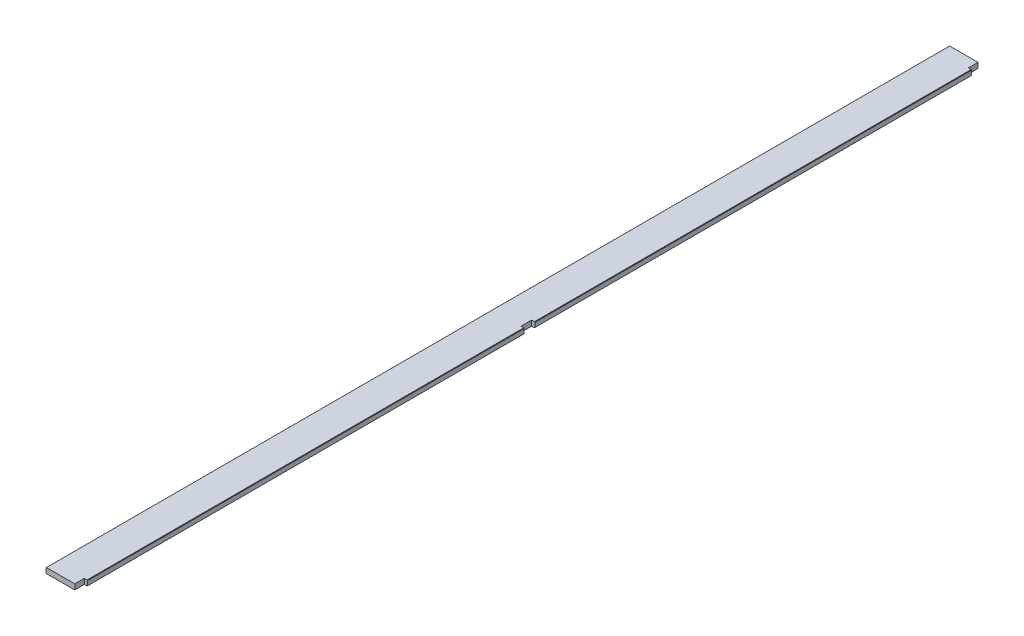
ISO-10303-21;
HEADER;
FILE_DESCRIPTION(('STEP AP214'),'2;1');
FILE_NAME('part.step','',(''),(''),'','','');
FILE_SCHEMA(('AUTOMOTIVE_DESIGN { 1 0 10303 214 1 1 1 1 }'));
ENDSEC;
DATA;
#1=APPLICATION_CONTEXT('core data for automotive mechanical design processes');
#2=APPLICATION_PROTOCOL_DEFINITION('international standard','automotive_design',2000,#1);
#3=PRODUCT_CONTEXT('',#1,'mechanical');
#4=PRODUCT('Part','Part','',(#3));
#5=PRODUCT_RELATED_PRODUCT_CATEGORY('part','',(#4));
#6=PRODUCT_DEFINITION_FORMATION('','',#4);
#7=PRODUCT_DEFINITION_CONTEXT('part definition',#1,'design');
#8=PRODUCT_DEFINITION('design','',#6,#7);
#9=PRODUCT_DEFINITION_SHAPE('','',#8);
#10=(LENGTH_UNIT() NAMED_UNIT(*) SI_UNIT(.MILLI.,.METRE.));
#11=(NAMED_UNIT(*) PLANE_ANGLE_UNIT() SI_UNIT($,.RADIAN.));
#12=(NAMED_UNIT(*) SI_UNIT($,.STERADIAN.) SOLID_ANGLE_UNIT());
#13=UNCERTAINTY_MEASURE_WITH_UNIT(LENGTH_MEASURE(1.E-05),#10,'distance_accuracy_value','');
#14=(GEOMETRIC_REPRESENTATION_CONTEXT(3) GLOBAL_UNCERTAINTY_ASSIGNED_CONTEXT((#13)) GLOBAL_UNIT_ASSIGNED_CONTEXT((#10,
#11,#12)) REPRESENTATION_CONTEXT('',''));
#15=CARTESIAN_POINT('',(0.,0.,0.));
#16=DIRECTION('',(0.,0.,1.));
#17=DIRECTION('',(1.,0.,0.));
#18=AXIS2_PLACEMENT_3D('',#15,#16,#17);
#19=CARTESIAN_POINT('',(73.,-12.5,4240.));
#20=DIRECTION('',(-0.707106781186547,0.707106781186548,0.));
#21=DIRECTION('',(-0.707106781186548,-0.707106781186547,0.));
#22=AXIS2_PLACEMENT_3D('',#19,#20,#21);
#23=PLANE('',#22);
#24=DIRECTION('',(0.,0.,-1.));
#25=VECTOR('',#24,1.);
#26=CARTESIAN_POINT('',(75.,-10.5,4240.));
#27=LINE('',#26,#25);
#28=CARTESIAN_POINT('',(75.,-10.5,4195.));
#29=VERTEX_POINT('',#28);
#30=CARTESIAN_POINT('',(75.,-10.5,2145.));
#31=VERTEX_POINT('',#30);
#32=EDGE_CURVE('E278',#29,#31,#27,.T.);
#33=ORIENTED_EDGE('',*,*,#32,.F.);
#34=DIRECTION('',(-0.707106781186548,-0.707106781186547,0.));
#35=VECTOR('',#34,1.);
#36=CARTESIAN_POINT('',(73.,-12.5,4195.));
#37=LINE('',#36,#35);
#38=CARTESIAN_POINT('',(73.,-12.5,4195.));
#39=VERTEX_POINT('',#38);
#40=EDGE_CURVE('E243',#29,#39,#37,.T.);
#41=ORIENTED_EDGE('',*,*,#40,.T.);
#42=DIRECTION('',(0.,0.,-1.));
#43=VECTOR('',#42,1.);
#44=CARTESIAN_POINT('',(73.,-12.5,4240.));
#45=LINE('',#44,#43);
#46=CARTESIAN_POINT('',(73.,-12.5,2145.));
#47=VERTEX_POINT('',#46);
#48=EDGE_CURVE('E281',#39,#47,#45,.T.);
#49=ORIENTED_EDGE('',*,*,#48,.T.);
#50=DIRECTION('',(0.707106781186548,0.707106781186547,0.));
#51=VECTOR('',#50,1.);
#52=CARTESIAN_POINT('',(73.,-12.5,2145.));
#53=LINE('',#52,#51);
#54=EDGE_CURVE('E240',#47,#31,#53,.T.);
#55=ORIENTED_EDGE('',*,*,#54,.T.);
#56=EDGE_LOOP('',(#33,#41,#49,#55));
#57=FACE_BOUND('',#56,.T.);
#58=ADVANCED_FACE('F37',(#57),#23,.F.);
#59=CARTESIAN_POINT('',(75.,10.5,4240.));
#60=DIRECTION('',(-1.,0.,0.));
#61=DIRECTION('',(0.,0.,1.));
#62=AXIS2_PLACEMENT_3D('',#59,#60,#61);
#63=PLANE('',#62);
#64=DIRECTION('',(0.,0.,-1.));
#65=VECTOR('',#64,1.);
#66=CARTESIAN_POINT('',(75.,10.5,4240.));
#67=LINE('',#66,#65);
#68=CARTESIAN_POINT('',(75.,10.5,4195.));
#69=VERTEX_POINT('',#68);
#70=CARTESIAN_POINT('',(75.,10.5,2145.));
#71=VERTEX_POINT('',#70);
#72=EDGE_CURVE('E274',#69,#71,#67,.T.);
#73=ORIENTED_EDGE('',*,*,#72,.F.);
#74=DIRECTION('',(0.,1.,0.));
#75=VECTOR('',#74,1.);
#76=CARTESIAN_POINT('',(75.,-12.5,4195.));
#77=LINE('',#76,#75);
#78=EDGE_CURVE('E205',#29,#69,#77,.T.);
#79=ORIENTED_EDGE('',*,*,#78,.F.);
#80=ORIENTED_EDGE('',*,*,#32,.T.);
#81=DIRECTION('',(0.,1.,0.));
#82=VECTOR('',#81,1.);
#83=CARTESIAN_POINT('',(75.,-12.5,2145.));
#84=LINE('',#83,#82);
#85=EDGE_CURVE('E208',#31,#71,#84,.T.);
#86=ORIENTED_EDGE('',*,*,#85,.T.);
#87=EDGE_LOOP('',(#73,#79,#80,#86));
#88=FACE_BOUND('',#87,.T.);
#89=ADVANCED_FACE('F308',(#88),#63,.F.);
#90=CARTESIAN_POINT('',(73.,12.5,4240.));
#91=DIRECTION('',(-0.707106781186547,-0.707106781186548,0.));
#92=DIRECTION('',(0.707106781186548,-0.707106781186547,0.));
#93=AXIS2_PLACEMENT_3D('',#90,#91,#92);
#94=PLANE('',#93);
#95=DIRECTION('',(0.,0.,-1.));
#96=VECTOR('',#95,1.);
#97=CARTESIAN_POINT('',(73.,12.5,4240.));
#98=LINE('',#97,#96);
#99=CARTESIAN_POINT('',(73.,12.5,4195.));
#100=VERTEX_POINT('',#99);
#101=CARTESIAN_POINT('',(73.,12.5,2145.));
#102=VERTEX_POINT('',#101);
#103=EDGE_CURVE('E270',#100,#102,#98,.T.);
#104=ORIENTED_EDGE('',*,*,#103,.F.);
#105=DIRECTION('',(0.707106781186548,-0.707106781186547,0.));
#106=VECTOR('',#105,1.);
#107=CARTESIAN_POINT('',(73.,12.5,4195.));
#108=LINE('',#107,#106);
#109=EDGE_CURVE('E45',#100,#69,#108,.T.);
#110=ORIENTED_EDGE('',*,*,#109,.T.);
#111=ORIENTED_EDGE('',*,*,#72,.T.);
#112=DIRECTION('',(-0.707106781186548,0.707106781186547,0.));
#113=VECTOR('',#112,1.);
#114=CARTESIAN_POINT('',(73.,12.5,2145.));
#115=LINE('',#114,#113);
#116=EDGE_CURVE('E295',#71,#102,#115,.T.);
#117=ORIENTED_EDGE('',*,*,#116,.T.);
#118=EDGE_LOOP('',(#104,#110,#111,#117));
#119=FACE_BOUND('',#118,.T.);
#120=ADVANCED_FACE('F302',(#119),#94,.F.);
#121=CARTESIAN_POINT('',(-73.,12.5,4240.));
#122=DIRECTION('',(0.,-1.,0.));
#123=DIRECTION('',(0.,0.,-1.));
#124=AXIS2_PLACEMENT_3D('',#121,#122,#123);
#125=PLANE('',#124);
#126=CARTESIAN_POINT('',(73.,12.5,2095.));
#127=VERTEX_POINT('',#126);
#128=CARTESIAN_POINT('',(73.,12.5,45.));
#129=VERTEX_POINT('',#128);
#130=EDGE_CURVE('E259',#127,#129,#98,.T.);
#131=ORIENTED_EDGE('',*,*,#130,.T.);
#132=DIRECTION('',(1.,0.,0.));
#133=VECTOR('',#132,1.);
#134=CARTESIAN_POINT('',(75.,12.5,45.));
#135=LINE('',#134,#133);
#136=CARTESIAN_POINT('',(60.,12.5,45.));
#137=VERTEX_POINT('',#136);
#138=EDGE_CURVE('E189',#137,#129,#135,.T.);
#139=ORIENTED_EDGE('',*,*,#138,.F.);
#140=DIRECTION('',(0.,0.,1.));
#141=VECTOR('',#140,1.);
#142=CARTESIAN_POINT('',(60.,12.5,0.));
#143=LINE('',#142,#141);
#144=CARTESIAN_POINT('',(60.,12.5,0.));
#145=VERTEX_POINT('',#144);
#146=EDGE_CURVE('E169',#145,#137,#143,.T.);
#147=ORIENTED_EDGE('',*,*,#146,.F.);
#148=DIRECTION('',(-1.,0.,0.));
#149=VECTOR('',#148,1.);
#150=CARTESIAN_POINT('',(-73.,12.5,0.));
#151=LINE('',#150,#149);
#152=CARTESIAN_POINT('',(-73.,12.5,0.));
#153=VERTEX_POINT('',#152);
#154=EDGE_CURVE('E247',#145,#153,#151,.T.);
#155=ORIENTED_EDGE('',*,*,#154,.T.);
#156=DIRECTION('',(0.,0.,-1.));
#157=VECTOR('',#156,1.);
#158=CARTESIAN_POINT('',(-73.,12.5,4240.));
#159=LINE('',#158,#157);
#160=CARTESIAN_POINT('',(-73.,12.5,4240.));
#161=VERTEX_POINT('',#160);
#162=EDGE_CURVE('E290',#161,#153,#159,.T.);
#163=ORIENTED_EDGE('',*,*,#162,.F.);
#164=DIRECTION('',(-1.,0.,0.));
#165=VECTOR('',#164,1.);
#166=CARTESIAN_POINT('',(-73.,12.5,4240.));
#167=LINE('',#166,#165);
#168=CARTESIAN_POINT('',(60.,12.5,4240.));
#169=VERTEX_POINT('',#168);
#170=EDGE_CURVE('E248',#169,#161,#167,.T.);
#171=ORIENTED_EDGE('',*,*,#170,.F.);
#172=DIRECTION('',(0.,0.,1.));
#173=VECTOR('',#172,1.);
#174=CARTESIAN_POINT('',(60.,12.5,4240.));
#175=LINE('',#174,#173);
#176=CARTESIAN_POINT('',(60.,12.5,4195.));
#177=VERTEX_POINT('',#176);
#178=EDGE_CURVE('E60',#177,#169,#175,.T.);
#179=ORIENTED_EDGE('',*,*,#178,.F.);
#180=DIRECTION('',(-1.,0.,0.));
#181=VECTOR('',#180,1.);
#182=CARTESIAN_POINT('',(75.,12.5,4195.));
#183=LINE('',#182,#181);
#184=EDGE_CURVE('E206',#100,#177,#183,.T.);
#185=ORIENTED_EDGE('',*,*,#184,.F.);
#186=ORIENTED_EDGE('',*,*,#103,.T.);
#187=DIRECTION('',(1.,0.,0.));
#188=VECTOR('',#187,1.);
#189=CARTESIAN_POINT('',(75.,12.5,2145.));
#190=LINE('',#189,#188);
#191=CARTESIAN_POINT('',(60.,12.5,2145.));
#192=VERTEX_POINT('',#191);
#193=EDGE_CURVE('E218',#192,#102,#190,.T.);
#194=ORIENTED_EDGE('',*,*,#193,.F.);
#195=DIRECTION('',(0.,0.,1.));
#196=VECTOR('',#195,1.);
#197=CARTESIAN_POINT('',(60.,12.5,2145.));
#198=LINE('',#197,#196);
#199=CARTESIAN_POINT('',(60.,12.5,2095.));
#200=VERTEX_POINT('',#199);
#201=EDGE_CURVE('E226',#200,#192,#198,.T.);
#202=ORIENTED_EDGE('',*,*,#201,.F.);
#203=DIRECTION('',(-1.,0.,0.));
#204=VECTOR('',#203,1.);
#205=CARTESIAN_POINT('',(75.,12.5,2095.));
#206=LINE('',#205,#204);
#207=EDGE_CURVE('E224',#127,#200,#206,.T.);
#208=ORIENTED_EDGE('',*,*,#207,.F.);
#209=EDGE_LOOP('',(#131,#139,#147,#155,#163,#171,#179,#185,#186,#194,#202,#208));
#210=FACE_BOUND('',#209,.T.);
#211=ADVANCED_FACE('F39',(#210),#125,.F.);
#212=CARTESIAN_POINT('',(-75.,10.5,4240.));
#213=DIRECTION('',(0.707106781186547,-0.707106781186548,0.));
#214=DIRECTION('',(0.707106781186548,0.707106781186547,0.));
#215=AXIS2_PLACEMENT_3D('',#212,#213,#214);
#216=PLANE('',#215);
#217=DIRECTION('',(-0.707106781186548,-0.707106781186547,0.));
#218=VECTOR('',#217,1.);
#219=CARTESIAN_POINT('',(-75.,10.5,0.));
#220=LINE('',#219,#218);
#221=CARTESIAN_POINT('',(-75.,10.5,0.));
#222=VERTEX_POINT('',#221);
#223=EDGE_CURVE('E261',#153,#222,#220,.T.);
#224=ORIENTED_EDGE('',*,*,#223,.T.);
#225=DIRECTION('',(0.,0.,-1.));
#226=VECTOR('',#225,1.);
#227=CARTESIAN_POINT('',(-75.,10.5,4240.));
#228=LINE('',#227,#226);
#229=CARTESIAN_POINT('',(-75.,10.5,4240.));
#230=VERTEX_POINT('',#229);
#231=EDGE_CURVE('E287',#230,#222,#228,.T.);
#232=ORIENTED_EDGE('',*,*,#231,.F.);
#233=DIRECTION('',(-0.707106781186548,-0.707106781186547,0.));
#234=VECTOR('',#233,1.);
#235=CARTESIAN_POINT('',(-75.,10.5,4240.));
#236=LINE('',#235,#234);
#237=EDGE_CURVE('E250',#161,#230,#236,.T.);
#238=ORIENTED_EDGE('',*,*,#237,.F.);
#239=ORIENTED_EDGE('',*,*,#162,.T.);
#240=EDGE_LOOP('',(#224,#232,#238,#239));
#241=FACE_BOUND('',#240,.T.);
#242=ADVANCED_FACE('F382',(#241),#216,.F.);
#243=CARTESIAN_POINT('',(-75.,10.5,4240.));
#244=DIRECTION('',(1.,0.,0.));
#245=DIRECTION('',(0.,0.,-1.));
#246=AXIS2_PLACEMENT_3D('',#243,#244,#245);
#247=PLANE('',#246);
#248=DIRECTION('',(0.,-1.,0.));
#249=VECTOR('',#248,1.);
#250=CARTESIAN_POINT('',(-75.,10.5,0.));
#251=LINE('',#250,#249);
#252=CARTESIAN_POINT('',(-75.,-10.5,0.));
#253=VERTEX_POINT('',#252);
#254=EDGE_CURVE('E263',#222,#253,#251,.T.);
#255=ORIENTED_EDGE('',*,*,#254,.T.);
#256=DIRECTION('',(0.,0.,-1.));
#257=VECTOR('',#256,1.);
#258=CARTESIAN_POINT('',(-75.,-10.5,4240.));
#259=LINE('',#258,#257);
#260=CARTESIAN_POINT('',(-75.,-10.5,4240.));
#261=VERTEX_POINT('',#260);
#262=EDGE_CURVE('E284',#261,#253,#259,.T.);
#263=ORIENTED_EDGE('',*,*,#262,.F.);
#264=DIRECTION('',(0.,-1.,0.));
#265=VECTOR('',#264,1.);
#266=CARTESIAN_POINT('',(-75.,10.5,4240.));
#267=LINE('',#266,#265);
#268=EDGE_CURVE('E252',#230,#261,#267,.T.);
#269=ORIENTED_EDGE('',*,*,#268,.F.);
#270=ORIENTED_EDGE('',*,*,#231,.T.);
#271=EDGE_LOOP('',(#255,#263,#269,#270));
#272=FACE_BOUND('',#271,.T.);
#273=ADVANCED_FACE('F378',(#272),#247,.F.);
#274=CARTESIAN_POINT('',(-75.,-10.5,4240.));
#275=DIRECTION('',(0.707106781186547,0.707106781186548,0.));
#276=DIRECTION('',(-0.707106781186548,0.707106781186547,0.));
#277=AXIS2_PLACEMENT_3D('',#274,#275,#276);
#278=PLANE('',#277);
#279=DIRECTION('',(0.707106781186548,-0.707106781186547,0.));
#280=VECTOR('',#279,1.);
#281=CARTESIAN_POINT('',(-75.,-10.5,0.));
#282=LINE('',#281,#280);
#283=CARTESIAN_POINT('',(-73.,-12.5,0.));
#284=VERTEX_POINT('',#283);
#285=EDGE_CURVE('E265',#253,#284,#282,.T.);
#286=ORIENTED_EDGE('',*,*,#285,.T.);
#287=DIRECTION('',(0.,0.,-1.));
#288=VECTOR('',#287,1.);
#289=CARTESIAN_POINT('',(-73.,-12.5,4240.));
#290=LINE('',#289,#288);
#291=CARTESIAN_POINT('',(-73.,-12.5,4240.));
#292=VERTEX_POINT('',#291);
#293=EDGE_CURVE('E282',#292,#284,#290,.T.);
#294=ORIENTED_EDGE('',*,*,#293,.F.);
#295=DIRECTION('',(0.707106781186548,-0.707106781186547,0.));
#296=VECTOR('',#295,1.);
#297=CARTESIAN_POINT('',(-75.,-10.5,4240.));
#298=LINE('',#297,#296);
#299=EDGE_CURVE('E254',#261,#292,#298,.T.);
#300=ORIENTED_EDGE('',*,*,#299,.F.);
#301=ORIENTED_EDGE('',*,*,#262,.T.);
#302=EDGE_LOOP('',(#286,#294,#300,#301));
#303=FACE_BOUND('',#302,.T.);
#304=ADVANCED_FACE('F336',(#303),#278,.F.);
#305=CARTESIAN_POINT('',(-73.,-12.5,4240.));
#306=DIRECTION('',(0.,1.,0.));
#307=DIRECTION('',(0.,0.,1.));
#308=AXIS2_PLACEMENT_3D('',#305,#306,#307);
#309=PLANE('',#308);
#310=DIRECTION('',(0.,0.,1.));
#311=VECTOR('',#310,1.);
#312=CARTESIAN_POINT('',(60.,-12.5,0.));
#313=LINE('',#312,#311);
#314=CARTESIAN_POINT('',(60.,-12.5,0.));
#315=VERTEX_POINT('',#314);
#316=CARTESIAN_POINT('',(60.,-12.5,45.));
#317=VERTEX_POINT('',#316);
#318=EDGE_CURVE('E166',#315,#317,#313,.T.);
#319=ORIENTED_EDGE('',*,*,#318,.T.);
#320=DIRECTION('',(1.,0.,0.));
#321=VECTOR('',#320,1.);
#322=CARTESIAN_POINT('',(75.,-12.5,45.));
#323=LINE('',#322,#321);
#324=CARTESIAN_POINT('',(73.,-12.5,45.));
#325=VERTEX_POINT('',#324);
#326=EDGE_CURVE('E176',#317,#325,#323,.T.);
#327=ORIENTED_EDGE('',*,*,#326,.T.);
#328=CARTESIAN_POINT('',(73.,-12.5,2095.));
#329=VERTEX_POINT('',#328);
#330=EDGE_CURVE('E279',#329,#325,#45,.T.);
#331=ORIENTED_EDGE('',*,*,#330,.F.);
#332=DIRECTION('',(-1.,0.,0.));
#333=VECTOR('',#332,1.);
#334=CARTESIAN_POINT('',(75.,-12.5,2095.));
#335=LINE('',#334,#333);
#336=CARTESIAN_POINT('',(60.,-12.5,2095.));
#337=VERTEX_POINT('',#336);
#338=EDGE_CURVE('E214',#329,#337,#335,.T.);
#339=ORIENTED_EDGE('',*,*,#338,.T.);
#340=DIRECTION('',(0.,0.,1.));
#341=VECTOR('',#340,1.);
#342=CARTESIAN_POINT('',(60.,-12.5,2145.));
#343=LINE('',#342,#341);
#344=CARTESIAN_POINT('',(60.,-12.5,2145.));
#345=VERTEX_POINT('',#344);
#346=EDGE_CURVE('E217',#337,#345,#343,.T.);
#347=ORIENTED_EDGE('',*,*,#346,.T.);
#348=DIRECTION('',(1.,0.,0.));
#349=VECTOR('',#348,1.);
#350=CARTESIAN_POINT('',(75.,-12.5,2145.));
#351=LINE('',#350,#349);
#352=EDGE_CURVE('E221',#345,#47,#351,.T.);
#353=ORIENTED_EDGE('',*,*,#352,.T.);
#354=ORIENTED_EDGE('',*,*,#48,.F.);
#355=DIRECTION('',(-1.,0.,0.));
#356=VECTOR('',#355,1.);
#357=CARTESIAN_POINT('',(75.,-12.5,4195.));
#358=LINE('',#357,#356);
#359=CARTESIAN_POINT('',(60.,-12.5,4195.));
#360=VERTEX_POINT('',#359);
#361=EDGE_CURVE('E199',#39,#360,#358,.T.);
#362=ORIENTED_EDGE('',*,*,#361,.T.);
#363=DIRECTION('',(0.,0.,1.));
#364=VECTOR('',#363,1.);
#365=CARTESIAN_POINT('',(60.,-12.5,4240.));
#366=LINE('',#365,#364);
#367=CARTESIAN_POINT('',(60.,-12.5,4240.));
#368=VERTEX_POINT('',#367);
#369=EDGE_CURVE('E202',#360,#368,#366,.T.);
#370=ORIENTED_EDGE('',*,*,#369,.T.);
#371=DIRECTION('',(1.,0.,0.));
#372=VECTOR('',#371,1.);
#373=CARTESIAN_POINT('',(-73.,-12.5,4240.));
#374=LINE('',#373,#372);
#375=EDGE_CURVE('E256',#292,#368,#374,.T.);
#376=ORIENTED_EDGE('',*,*,#375,.F.);
#377=ORIENTED_EDGE('',*,*,#293,.T.);
#378=DIRECTION('',(1.,0.,0.));
#379=VECTOR('',#378,1.);
#380=CARTESIAN_POINT('',(-73.,-12.5,0.));
#381=LINE('',#380,#379);
#382=EDGE_CURVE('E188',#284,#315,#381,.T.);
#383=ORIENTED_EDGE('',*,*,#382,.T.);
#384=EDGE_LOOP('',(#319,#327,#331,#339,#347,#353,#354,#362,#370,#376,#377,#383));
#385=FACE_BOUND('',#384,.T.);
#386=ADVANCED_FACE('F185',(#385),#309,.F.);
#387=ORIENTED_EDGE('',*,*,#330,.T.);
#388=DIRECTION('',(0.707106781186548,0.707106781186547,0.));
#389=VECTOR('',#388,1.);
#390=CARTESIAN_POINT('',(73.,-12.5,44.9999999999999));
#391=LINE('',#390,#389);
#392=CARTESIAN_POINT('',(75.,-10.5,45.));
#393=VERTEX_POINT('',#392);
#394=EDGE_CURVE('E179',#325,#393,#391,.T.);
#395=ORIENTED_EDGE('',*,*,#394,.T.);
#396=CARTESIAN_POINT('',(75.,-10.5,2095.));
#397=VERTEX_POINT('',#396);
#398=EDGE_CURVE('E275',#397,#393,#27,.T.);
#399=ORIENTED_EDGE('',*,*,#398,.F.);
#400=DIRECTION('',(-0.707106781186548,-0.707106781186547,0.));
#401=VECTOR('',#400,1.);
#402=CARTESIAN_POINT('',(73.,-12.5,2095.));
#403=LINE('',#402,#401);
#404=EDGE_CURVE('E196',#397,#329,#403,.T.);
#405=ORIENTED_EDGE('',*,*,#404,.T.);
#406=EDGE_LOOP('',(#387,#395,#399,#405));
#407=FACE_BOUND('',#406,.T.);
#408=ADVANCED_FACE('F352',(#407),#23,.F.);
#409=ORIENTED_EDGE('',*,*,#398,.T.);
#410=DIRECTION('',(0.,1.,0.));
#411=VECTOR('',#410,1.);
#412=CARTESIAN_POINT('',(75.,-12.5,45.));
#413=LINE('',#412,#411);
#414=CARTESIAN_POINT('',(75.,10.5,45.));
#415=VERTEX_POINT('',#414);
#416=EDGE_CURVE('E172',#393,#415,#413,.T.);
#417=ORIENTED_EDGE('',*,*,#416,.T.);
#418=CARTESIAN_POINT('',(75.,10.5,2095.));
#419=VERTEX_POINT('',#418);
#420=EDGE_CURVE('E271',#419,#415,#67,.T.);
#421=ORIENTED_EDGE('',*,*,#420,.F.);
#422=DIRECTION('',(0.,1.,0.));
#423=VECTOR('',#422,1.);
#424=CARTESIAN_POINT('',(75.,-12.5,2095.));
#425=LINE('',#424,#423);
#426=EDGE_CURVE('E52',#397,#419,#425,.T.);
#427=ORIENTED_EDGE('',*,*,#426,.F.);
#428=EDGE_LOOP('',(#409,#417,#421,#427));
#429=FACE_BOUND('',#428,.T.);
#430=ADVANCED_FACE('F349',(#429),#63,.F.);
#431=ORIENTED_EDGE('',*,*,#420,.T.);
#432=DIRECTION('',(-0.707106781186548,0.707106781186547,0.));
#433=VECTOR('',#432,1.);
#434=CARTESIAN_POINT('',(73.,12.5,44.9999999999999));
#435=LINE('',#434,#433);
#436=EDGE_CURVE('E11',#415,#129,#435,.T.);
#437=ORIENTED_EDGE('',*,*,#436,.T.);
#438=ORIENTED_EDGE('',*,*,#130,.F.);
#439=DIRECTION('',(0.707106781186548,-0.707106781186547,0.));
#440=VECTOR('',#439,1.);
#441=CARTESIAN_POINT('',(73.,12.5,2095.));
#442=LINE('',#441,#440);
#443=EDGE_CURVE('E293',#127,#419,#442,.T.);
#444=ORIENTED_EDGE('',*,*,#443,.T.);
#445=EDGE_LOOP('',(#431,#437,#438,#444));
#446=FACE_BOUND('',#445,.T.);
#447=ADVANCED_FACE('F346',(#446),#94,.F.);
#448=CARTESIAN_POINT('',(0.,0.,4240.));
#449=DIRECTION('',(0.,0.,-1.));
#450=DIRECTION('',(-1.,0.,0.));
#451=AXIS2_PLACEMENT_3D('',#448,#449,#450);
#452=PLANE('',#451);
#453=ORIENTED_EDGE('',*,*,#375,.T.);
#454=DIRECTION('',(0.,1.,0.));
#455=VECTOR('',#454,1.);
#456=CARTESIAN_POINT('',(60.,-12.5,4240.));
#457=LINE('',#456,#455);
#458=EDGE_CURVE('E193',#368,#169,#457,.T.);
#459=ORIENTED_EDGE('',*,*,#458,.T.);
#460=ORIENTED_EDGE('',*,*,#170,.T.);
#461=ORIENTED_EDGE('',*,*,#237,.T.);
#462=ORIENTED_EDGE('',*,*,#268,.T.);
#463=ORIENTED_EDGE('',*,*,#299,.T.);
#464=EDGE_LOOP('',(#453,#459,#460,#461,#462,#463));
#465=FACE_BOUND('',#464,.T.);
#466=ADVANCED_FACE('F330',(#465),#452,.F.);
#467=CARTESIAN_POINT('',(0.,0.,0.));
#468=DIRECTION('',(0.,0.,-1.));
#469=DIRECTION('',(-1.,0.,0.));
#470=AXIS2_PLACEMENT_3D('',#467,#468,#469);
#471=PLANE('',#470);
#472=DIRECTION('',(0.,1.,0.));
#473=VECTOR('',#472,1.);
#474=CARTESIAN_POINT('',(60.,-12.5,0.));
#475=LINE('',#474,#473);
#476=EDGE_CURVE('E173',#315,#145,#475,.T.);
#477=ORIENTED_EDGE('',*,*,#476,.F.);
#478=ORIENTED_EDGE('',*,*,#382,.F.);
#479=ORIENTED_EDGE('',*,*,#285,.F.);
#480=ORIENTED_EDGE('',*,*,#254,.F.);
#481=ORIENTED_EDGE('',*,*,#223,.F.);
#482=ORIENTED_EDGE('',*,*,#154,.F.);
#483=EDGE_LOOP('',(#477,#478,#479,#480,#481,#482));
#484=FACE_BOUND('',#483,.T.);
#485=ADVANCED_FACE('F339',(#484),#471,.T.);
#486=CARTESIAN_POINT('',(75.,-12.5,45.));
#487=DIRECTION('',(0.,0.,1.));
#488=DIRECTION('',(1.,0.,0.));
#489=AXIS2_PLACEMENT_3D('',#486,#487,#488);
#490=PLANE('',#489);
#491=ORIENTED_EDGE('',*,*,#326,.F.);
#492=DIRECTION('',(0.,1.,0.));
#493=VECTOR('',#492,1.);
#494=CARTESIAN_POINT('',(60.,-12.5,45.));
#495=LINE('',#494,#493);
#496=EDGE_CURVE('E162',#317,#137,#495,.T.);
#497=ORIENTED_EDGE('',*,*,#496,.T.);
#498=ORIENTED_EDGE('',*,*,#138,.T.);
#499=ORIENTED_EDGE('',*,*,#436,.F.);
#500=ORIENTED_EDGE('',*,*,#416,.F.);
#501=ORIENTED_EDGE('',*,*,#394,.F.);
#502=EDGE_LOOP('',(#491,#497,#498,#499,#500,#501));
#503=FACE_BOUND('',#502,.T.);
#504=ADVANCED_FACE('F177',(#503),#490,.F.);
#505=CARTESIAN_POINT('',(60.,-12.5,0.));
#506=DIRECTION('',(-1.,0.,0.));
#507=DIRECTION('',(0.,0.,1.));
#508=AXIS2_PLACEMENT_3D('',#505,#506,#507);
#509=PLANE('',#508);
#510=ORIENTED_EDGE('',*,*,#146,.T.);
#511=ORIENTED_EDGE('',*,*,#496,.F.);
#512=ORIENTED_EDGE('',*,*,#318,.F.);
#513=ORIENTED_EDGE('',*,*,#476,.T.);
#514=EDGE_LOOP('',(#510,#511,#512,#513));
#515=FACE_BOUND('',#514,.T.);
#516=ADVANCED_FACE('F164',(#515),#509,.F.);
#517=CARTESIAN_POINT('',(75.,-12.5,4195.));
#518=DIRECTION('',(0.,0.,-1.));
#519=DIRECTION('',(-1.,0.,0.));
#520=AXIS2_PLACEMENT_3D('',#517,#518,#519);
#521=PLANE('',#520);
#522=ORIENTED_EDGE('',*,*,#78,.T.);
#523=ORIENTED_EDGE('',*,*,#109,.F.);
#524=ORIENTED_EDGE('',*,*,#184,.T.);
#525=DIRECTION('',(0.,1.,0.));
#526=VECTOR('',#525,1.);
#527=CARTESIAN_POINT('',(60.,-12.5,4195.));
#528=LINE('',#527,#526);
#529=EDGE_CURVE('E211',#360,#177,#528,.T.);
#530=ORIENTED_EDGE('',*,*,#529,.F.);
#531=ORIENTED_EDGE('',*,*,#361,.F.);
#532=ORIENTED_EDGE('',*,*,#40,.F.);
#533=EDGE_LOOP('',(#522,#523,#524,#530,#531,#532));
#534=FACE_BOUND('',#533,.T.);
#535=ADVANCED_FACE('F325',(#534),#521,.F.);
#536=CARTESIAN_POINT('',(60.,-12.5,4240.));
#537=DIRECTION('',(-1.,0.,0.));
#538=DIRECTION('',(0.,0.,1.));
#539=AXIS2_PLACEMENT_3D('',#536,#537,#538);
#540=PLANE('',#539);
#541=ORIENTED_EDGE('',*,*,#178,.T.);
#542=ORIENTED_EDGE('',*,*,#458,.F.);
#543=ORIENTED_EDGE('',*,*,#369,.F.);
#544=ORIENTED_EDGE('',*,*,#529,.T.);
#545=EDGE_LOOP('',(#541,#542,#543,#544));
#546=FACE_BOUND('',#545,.T.);
#547=ADVANCED_FACE('F327',(#546),#540,.F.);
#548=CARTESIAN_POINT('',(75.,-12.5,2145.));
#549=DIRECTION('',(0.,0.,1.));
#550=DIRECTION('',(1.,0.,0.));
#551=AXIS2_PLACEMENT_3D('',#548,#549,#550);
#552=PLANE('',#551);
#553=ORIENTED_EDGE('',*,*,#352,.F.);
#554=DIRECTION('',(0.,1.,0.));
#555=VECTOR('',#554,1.);
#556=CARTESIAN_POINT('',(60.,-12.5,2145.));
#557=LINE('',#556,#555);
#558=EDGE_CURVE('E232',#345,#192,#557,.T.);
#559=ORIENTED_EDGE('',*,*,#558,.T.);
#560=ORIENTED_EDGE('',*,*,#193,.T.);
#561=ORIENTED_EDGE('',*,*,#116,.F.);
#562=ORIENTED_EDGE('',*,*,#85,.F.);
#563=ORIENTED_EDGE('',*,*,#54,.F.);
#564=EDGE_LOOP('',(#553,#559,#560,#561,#562,#563));
#565=FACE_BOUND('',#564,.T.);
#566=ADVANCED_FACE('F313',(#565),#552,.F.);
#567=CARTESIAN_POINT('',(75.,-12.5,2095.));
#568=DIRECTION('',(0.,0.,-1.));
#569=DIRECTION('',(-1.,0.,0.));
#570=AXIS2_PLACEMENT_3D('',#567,#568,#569);
#571=PLANE('',#570);
#572=ORIENTED_EDGE('',*,*,#426,.T.);
#573=ORIENTED_EDGE('',*,*,#443,.F.);
#574=ORIENTED_EDGE('',*,*,#207,.T.);
#575=DIRECTION('',(0.,1.,0.));
#576=VECTOR('',#575,1.);
#577=CARTESIAN_POINT('',(60.,-12.5,2095.));
#578=LINE('',#577,#576);
#579=EDGE_CURVE('E234',#337,#200,#578,.T.);
#580=ORIENTED_EDGE('',*,*,#579,.F.);
#581=ORIENTED_EDGE('',*,*,#338,.F.);
#582=ORIENTED_EDGE('',*,*,#404,.F.);
#583=EDGE_LOOP('',(#572,#573,#574,#580,#581,#582));
#584=FACE_BOUND('',#583,.T.);
#585=ADVANCED_FACE('F353',(#584),#571,.F.);
#586=CARTESIAN_POINT('',(60.,-12.5,2145.));
#587=DIRECTION('',(-1.,0.,0.));
#588=DIRECTION('',(0.,0.,1.));
#589=AXIS2_PLACEMENT_3D('',#586,#587,#588);
#590=PLANE('',#589);
#591=ORIENTED_EDGE('',*,*,#201,.T.);
#592=ORIENTED_EDGE('',*,*,#558,.F.);
#593=ORIENTED_EDGE('',*,*,#346,.F.);
#594=ORIENTED_EDGE('',*,*,#579,.T.);
#595=EDGE_LOOP('',(#591,#592,#593,#594));
#596=FACE_BOUND('',#595,.T.);
#597=ADVANCED_FACE('F321',(#596),#590,.F.);
#598=CLOSED_SHELL('',(#58,#89,#120,#211,#242,#273,#304,#386,#408,#430,#447,#466,#485,#504,#516,
#535,#547,#566,#585,#597));
#599=MANIFOLD_SOLID_BREP('B2',#598);
#600=ADVANCED_BREP_SHAPE_REPRESENTATION('',(#18,#599),#14);
#601=SHAPE_DEFINITION_REPRESENTATION(#9,#600);
ENDSEC;
END-ISO-10303-21;
